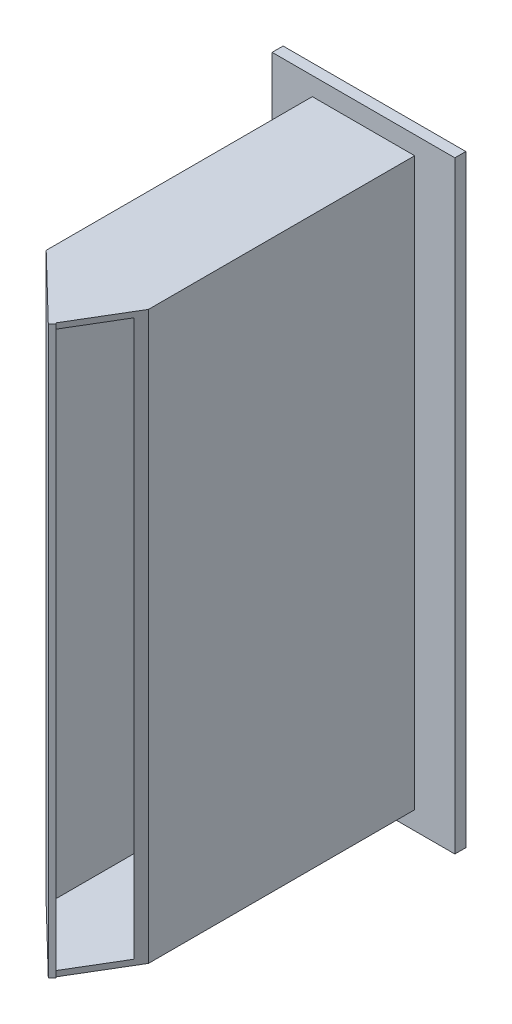
ISO-10303-21;
HEADER;
FILE_DESCRIPTION(('STEP AP214'),'2;1');
FILE_NAME('part.step','',(''),(''),'','','');
FILE_SCHEMA(('AUTOMOTIVE_DESIGN { 1 0 10303 214 1 1 1 1 }'));
ENDSEC;
DATA;
#1=APPLICATION_CONTEXT('core data for automotive mechanical design processes');
#2=APPLICATION_PROTOCOL_DEFINITION('international standard','automotive_design',2000,#1);
#3=PRODUCT_CONTEXT('',#1,'mechanical');
#4=PRODUCT('Part','Part','',(#3));
#5=PRODUCT_RELATED_PRODUCT_CATEGORY('part','',(#4));
#6=PRODUCT_DEFINITION_FORMATION('','',#4);
#7=PRODUCT_DEFINITION_CONTEXT('part definition',#1,'design');
#8=PRODUCT_DEFINITION('design','',#6,#7);
#9=PRODUCT_DEFINITION_SHAPE('','',#8);
#10=(LENGTH_UNIT() NAMED_UNIT(*) SI_UNIT(.MILLI.,.METRE.));
#11=(NAMED_UNIT(*) PLANE_ANGLE_UNIT() SI_UNIT($,.RADIAN.));
#12=(NAMED_UNIT(*) SI_UNIT($,.STERADIAN.) SOLID_ANGLE_UNIT());
#13=UNCERTAINTY_MEASURE_WITH_UNIT(LENGTH_MEASURE(1.E-05),#10,'distance_accuracy_value','');
#14=(GEOMETRIC_REPRESENTATION_CONTEXT(3) GLOBAL_UNCERTAINTY_ASSIGNED_CONTEXT((#13)) GLOBAL_UNIT_ASSIGNED_CONTEXT((#10,
#11,#12)) REPRESENTATION_CONTEXT('',''));
#15=CARTESIAN_POINT('',(0.,0.,0.));
#16=DIRECTION('',(0.,0.,1.));
#17=DIRECTION('',(1.,0.,0.));
#18=AXIS2_PLACEMENT_3D('',#15,#16,#17);
#19=CARTESIAN_POINT('',(2.5,31.7,0.6));
#20=DIRECTION('',(1.,0.,0.));
#21=DIRECTION('',(0.,1.,0.));
#22=AXIS2_PLACEMENT_3D('',#19,#20,#21);
#23=PLANE('',#22);
#24=DIRECTION('',(0.,0.,-1.));
#25=VECTOR('',#24,1.);
#26=CARTESIAN_POINT('',(2.5,31.7,0.6));
#27=LINE('',#26,#25);
#28=CARTESIAN_POINT('',(2.5,31.7,15.0387089135817));
#29=VERTEX_POINT('',#28);
#30=CARTESIAN_POINT('',(2.5,31.7,0.));
#31=VERTEX_POINT('',#30);
#32=EDGE_CURVE('E234',#29,#31,#27,.T.);
#33=ORIENTED_EDGE('',*,*,#32,.F.);
#34=DIRECTION('',(0.,-1.,0.));
#35=VECTOR('',#34,1.);
#36=CARTESIAN_POINT('',(2.5,31.7,15.0387089135817));
#37=LINE('',#36,#35);
#38=CARTESIAN_POINT('',(2.5,1.3,15.0387089135817));
#39=VERTEX_POINT('',#38);
#40=EDGE_CURVE('E179',#29,#39,#37,.T.);
#41=ORIENTED_EDGE('',*,*,#40,.T.);
#42=DIRECTION('',(0.,0.,-1.));
#43=VECTOR('',#42,1.);
#44=CARTESIAN_POINT('',(2.5,1.3,0.6));
#45=LINE('',#44,#43);
#46=CARTESIAN_POINT('',(2.5,1.3,0.));
#47=VERTEX_POINT('',#46);
#48=EDGE_CURVE('E240',#39,#47,#45,.T.);
#49=ORIENTED_EDGE('',*,*,#48,.T.);
#50=DIRECTION('',(0.,-1.,0.));
#51=VECTOR('',#50,1.);
#52=CARTESIAN_POINT('',(2.5,31.7,0.));
#53=LINE('',#52,#51);
#54=EDGE_CURVE('E222',#31,#47,#53,.T.);
#55=ORIENTED_EDGE('',*,*,#54,.F.);
#56=EDGE_LOOP('',(#33,#41,#49,#55));
#57=FACE_BOUND('',#56,.T.);
#58=ADVANCED_FACE('F35',(#57),#23,.T.);
#59=CARTESIAN_POINT('',(2.5,1.3,0.6));
#60=DIRECTION('',(0.,1.,0.));
#61=DIRECTION('',(-1.,0.,0.));
#62=AXIS2_PLACEMENT_3D('',#59,#60,#61);
#63=PLANE('',#62);
#64=ORIENTED_EDGE('',*,*,#48,.F.);
#65=DIRECTION('',(0.7186374720968,0.,0.695384917652318));
#66=VECTOR('',#65,1.);
#67=CARTESIAN_POINT('',(-4.71545108692323,1.3,8.05672417896356));
#68=LINE('',#67,#66);
#69=CARTESIAN_POINT('',(5.90696835590224,1.3,18.3354398823977));
#70=VERTEX_POINT('',#69);
#71=EDGE_CURVE('E182',#39,#70,#68,.T.);
#72=ORIENTED_EDGE('',*,*,#71,.T.);
#73=DIRECTION('',(-0.512760200720184,0.,0.85853187276734));
#74=VECTOR('',#73,1.);
#75=CARTESIAN_POINT('',(12.8187105792584,1.3,6.76287440877329));
#76=LINE('',#75,#74);
#77=CARTESIAN_POINT('',(7.5,1.3,15.668172729323));
#78=VERTEX_POINT('',#77);
#79=EDGE_CURVE('E199',#78,#70,#76,.T.);
#80=ORIENTED_EDGE('',*,*,#79,.F.);
#81=DIRECTION('',(0.,0.,-1.));
#82=VECTOR('',#81,1.);
#83=CARTESIAN_POINT('',(7.5,1.3,0.6));
#84=LINE('',#83,#82);
#85=CARTESIAN_POINT('',(7.5,1.3,0.));
#86=VERTEX_POINT('',#85);
#87=EDGE_CURVE('E238',#78,#86,#84,.T.);
#88=ORIENTED_EDGE('',*,*,#87,.T.);
#89=DIRECTION('',(1.,0.,0.));
#90=VECTOR('',#89,1.);
#91=CARTESIAN_POINT('',(2.5,1.3,0.));
#92=LINE('',#91,#90);
#93=EDGE_CURVE('E225',#47,#86,#92,.T.);
#94=ORIENTED_EDGE('',*,*,#93,.F.);
#95=EDGE_LOOP('',(#64,#72,#80,#88,#94));
#96=FACE_BOUND('',#95,.T.);
#97=ADVANCED_FACE('F291',(#96),#63,.T.);
#98=CARTESIAN_POINT('',(2.5,31.7,0.6));
#99=DIRECTION('',(0.,-1.,0.));
#100=DIRECTION('',(0.,0.,-1.));
#101=AXIS2_PLACEMENT_3D('',#98,#99,#100);
#102=PLANE('',#101);
#103=DIRECTION('',(0.512760200720184,0.,-0.85853187276734));
#104=VECTOR('',#103,1.);
#105=CARTESIAN_POINT('',(12.8187105792584,31.7,6.76287440877329));
#106=LINE('',#105,#104);
#107=CARTESIAN_POINT('',(5.90696835590223,31.7,18.3354398823977));
#108=VERTEX_POINT('',#107);
#109=CARTESIAN_POINT('',(7.5,31.7,15.668172729323));
#110=VERTEX_POINT('',#109);
#111=EDGE_CURVE('E195',#108,#110,#106,.T.);
#112=ORIENTED_EDGE('',*,*,#111,.F.);
#113=DIRECTION('',(-0.7186374720968,0.,-0.695384917652318));
#114=VECTOR('',#113,1.);
#115=CARTESIAN_POINT('',(-4.71545108692323,31.7,8.05672417896356));
#116=LINE('',#115,#114);
#117=EDGE_CURVE('E175',#108,#29,#116,.T.);
#118=ORIENTED_EDGE('',*,*,#117,.T.);
#119=ORIENTED_EDGE('',*,*,#32,.T.);
#120=DIRECTION('',(-1.,0.,0.));
#121=VECTOR('',#120,1.);
#122=CARTESIAN_POINT('',(2.5,31.7,0.));
#123=LINE('',#122,#121);
#124=CARTESIAN_POINT('',(7.5,31.7,0.));
#125=VERTEX_POINT('',#124);
#126=EDGE_CURVE('E231',#125,#31,#123,.T.);
#127=ORIENTED_EDGE('',*,*,#126,.F.);
#128=DIRECTION('',(0.,0.,-1.));
#129=VECTOR('',#128,1.);
#130=CARTESIAN_POINT('',(7.5,31.7,0.6));
#131=LINE('',#130,#129);
#132=EDGE_CURVE('E236',#110,#125,#131,.T.);
#133=ORIENTED_EDGE('',*,*,#132,.F.);
#134=EDGE_LOOP('',(#112,#118,#119,#127,#133));
#135=FACE_BOUND('',#134,.T.);
#136=ADVANCED_FACE('F282',(#135),#102,.T.);
#137=CARTESIAN_POINT('',(5.74895919711926,0.,18.6));
#138=DIRECTION('',(-0.85853187276734,0.,-0.512760200720184));
#139=DIRECTION('',(-0.512760200720184,0.,0.85853187276734));
#140=AXIS2_PLACEMENT_3D('',#137,#138,#139);
#141=PLANE('',#140);
#142=DIRECTION('',(0.,1.,0.));
#143=VECTOR('',#142,1.);
#144=CARTESIAN_POINT('',(5.90696835590223,0.,18.3354398823977));
#145=LINE('',#144,#143);
#146=CARTESIAN_POINT('',(5.90696835590223,1.,18.3354398823977));
#147=VERTEX_POINT('',#146);
#148=EDGE_CURVE('E11',#147,#70,#145,.T.);
#149=ORIENTED_EDGE('',*,*,#148,.F.);
#150=DIRECTION('',(-0.512760200720184,0.,0.85853187276734));
#151=VECTOR('',#150,1.);
#152=CARTESIAN_POINT('',(4.81585611493823,1.,20.1623262794279));
#153=LINE('',#152,#151);
#154=CARTESIAN_POINT('',(7.8,1.,15.1658725089306));
#155=VERTEX_POINT('',#154);
#156=EDGE_CURVE('E155',#155,#147,#153,.T.);
#157=ORIENTED_EDGE('',*,*,#156,.F.);
#158=DIRECTION('',(0.,1.,0.));
#159=VECTOR('',#158,1.);
#160=CARTESIAN_POINT('',(7.8,0.,15.1658725089306));
#161=LINE('',#160,#159);
#162=CARTESIAN_POINT('',(7.8,32.,15.1658725089306));
#163=VERTEX_POINT('',#162);
#164=EDGE_CURVE('E50',#155,#163,#161,.T.);
#165=ORIENTED_EDGE('',*,*,#164,.T.);
#166=DIRECTION('',(-0.512760200720184,0.,0.85853187276734));
#167=VECTOR('',#166,1.);
#168=CARTESIAN_POINT('',(5.74895919711926,32.,18.6));
#169=LINE('',#168,#167);
#170=CARTESIAN_POINT('',(5.90696835590224,32.,18.3354398823977));
#171=VERTEX_POINT('',#170);
#172=EDGE_CURVE('E185',#163,#171,#169,.T.);
#173=ORIENTED_EDGE('',*,*,#172,.T.);
#174=EDGE_CURVE('E39',#108,#171,#145,.T.);
#175=ORIENTED_EDGE('',*,*,#174,.F.);
#176=ORIENTED_EDGE('',*,*,#111,.T.);
#177=DIRECTION('',(0.,-1.,0.));
#178=VECTOR('',#177,1.);
#179=CARTESIAN_POINT('',(7.5,31.7,15.668172729323));
#180=LINE('',#179,#178);
#181=EDGE_CURVE('E197',#110,#78,#180,.T.);
#182=ORIENTED_EDGE('',*,*,#181,.T.);
#183=ORIENTED_EDGE('',*,*,#79,.T.);
#184=EDGE_LOOP('',(#149,#157,#165,#173,#175,#176,#182,#183));
#185=FACE_BOUND('',#184,.T.);
#186=ADVANCED_FACE('F279',(#185),#141,.F.);
#187=CARTESIAN_POINT('',(0.,0.,0.6));
#188=DIRECTION('',(0.,0.,-1.));
#189=DIRECTION('',(-1.,0.,0.));
#190=AXIS2_PLACEMENT_3D('',#187,#188,#189);
#191=PLANE('',#190);
#192=DIRECTION('',(0.,-1.,0.));
#193=VECTOR('',#192,1.);
#194=CARTESIAN_POINT('',(0.,0.,0.6));
#195=LINE('',#194,#193);
#196=CARTESIAN_POINT('',(0.,33.,0.6));
#197=VERTEX_POINT('',#196);
#198=CARTESIAN_POINT('',(0.,0.,0.6));
#199=VERTEX_POINT('',#198);
#200=EDGE_CURVE('E243',#197,#199,#195,.T.);
#201=ORIENTED_EDGE('',*,*,#200,.T.);
#202=DIRECTION('',(1.,0.,0.));
#203=VECTOR('',#202,1.);
#204=CARTESIAN_POINT('',(0.,0.,0.6));
#205=LINE('',#204,#203);
#206=CARTESIAN_POINT('',(10.,0.,0.6));
#207=VERTEX_POINT('',#206);
#208=EDGE_CURVE('E246',#199,#207,#205,.T.);
#209=ORIENTED_EDGE('',*,*,#208,.T.);
#210=DIRECTION('',(0.,1.,0.));
#211=VECTOR('',#210,1.);
#212=CARTESIAN_POINT('',(10.,0.,0.6));
#213=LINE('',#212,#211);
#214=CARTESIAN_POINT('',(10.,33.,0.6));
#215=VERTEX_POINT('',#214);
#216=EDGE_CURVE('E249',#207,#215,#213,.T.);
#217=ORIENTED_EDGE('',*,*,#216,.T.);
#218=DIRECTION('',(-1.,0.,0.));
#219=VECTOR('',#218,1.);
#220=CARTESIAN_POINT('',(0.,33.,0.6));
#221=LINE('',#220,#219);
#222=EDGE_CURVE('E251',#215,#197,#221,.T.);
#223=ORIENTED_EDGE('',*,*,#222,.T.);
#224=EDGE_LOOP('',(#201,#209,#217,#223));
#225=FACE_BOUND('',#224,.T.);
#226=DIRECTION('',(0.,-1.,0.));
#227=VECTOR('',#226,1.);
#228=CARTESIAN_POINT('',(2.2,32.,0.6));
#229=LINE('',#228,#227);
#230=CARTESIAN_POINT('',(2.2,32.,0.6));
#231=VERTEX_POINT('',#230);
#232=CARTESIAN_POINT('',(2.2,1.,0.6));
#233=VERTEX_POINT('',#232);
#234=EDGE_CURVE('E204',#231,#233,#229,.T.);
#235=ORIENTED_EDGE('',*,*,#234,.F.);
#236=DIRECTION('',(-1.,0.,0.));
#237=VECTOR('',#236,1.);
#238=CARTESIAN_POINT('',(2.2,32.,0.6));
#239=LINE('',#238,#237);
#240=CARTESIAN_POINT('',(7.8,32.,0.6));
#241=VERTEX_POINT('',#240);
#242=EDGE_CURVE('E212',#241,#231,#239,.T.);
#243=ORIENTED_EDGE('',*,*,#242,.F.);
#244=DIRECTION('',(0.,1.,0.));
#245=VECTOR('',#244,1.);
#246=CARTESIAN_POINT('',(7.8,32.,0.6));
#247=LINE('',#246,#245);
#248=CARTESIAN_POINT('',(7.8,1.,0.6));
#249=VERTEX_POINT('',#248);
#250=EDGE_CURVE('E209',#249,#241,#247,.T.);
#251=ORIENTED_EDGE('',*,*,#250,.F.);
#252=DIRECTION('',(1.,0.,0.));
#253=VECTOR('',#252,1.);
#254=CARTESIAN_POINT('',(2.2,1.,0.6));
#255=LINE('',#254,#253);
#256=EDGE_CURVE('E207',#233,#249,#255,.T.);
#257=ORIENTED_EDGE('',*,*,#256,.F.);
#258=EDGE_LOOP('',(#235,#243,#251,#257));
#259=FACE_BOUND('',#258,.T.);
#260=ADVANCED_FACE('F281',(#225,#259),#191,.F.);
#261=CARTESIAN_POINT('',(0.,0.,0.));
#262=DIRECTION('',(0.,0.,-1.));
#263=DIRECTION('',(-1.,0.,0.));
#264=AXIS2_PLACEMENT_3D('',#261,#262,#263);
#265=PLANE('',#264);
#266=DIRECTION('',(0.,-1.,0.));
#267=VECTOR('',#266,1.);
#268=CARTESIAN_POINT('',(0.,0.,0.));
#269=LINE('',#268,#267);
#270=CARTESIAN_POINT('',(0.,33.,0.));
#271=VERTEX_POINT('',#270);
#272=CARTESIAN_POINT('',(0.,0.,0.));
#273=VERTEX_POINT('',#272);
#274=EDGE_CURVE('E242',#271,#273,#269,.T.);
#275=ORIENTED_EDGE('',*,*,#274,.F.);
#276=DIRECTION('',(-1.,0.,0.));
#277=VECTOR('',#276,1.);
#278=CARTESIAN_POINT('',(0.,33.,0.));
#279=LINE('',#278,#277);
#280=CARTESIAN_POINT('',(10.,33.,0.));
#281=VERTEX_POINT('',#280);
#282=EDGE_CURVE('E247',#281,#271,#279,.T.);
#283=ORIENTED_EDGE('',*,*,#282,.F.);
#284=DIRECTION('',(0.,1.,0.));
#285=VECTOR('',#284,1.);
#286=CARTESIAN_POINT('',(10.,0.,0.));
#287=LINE('',#286,#285);
#288=CARTESIAN_POINT('',(10.,0.,0.));
#289=VERTEX_POINT('',#288);
#290=EDGE_CURVE('E258',#289,#281,#287,.T.);
#291=ORIENTED_EDGE('',*,*,#290,.F.);
#292=DIRECTION('',(1.,0.,0.));
#293=VECTOR('',#292,1.);
#294=CARTESIAN_POINT('',(0.,0.,0.));
#295=LINE('',#294,#293);
#296=EDGE_CURVE('E256',#273,#289,#295,.T.);
#297=ORIENTED_EDGE('',*,*,#296,.F.);
#298=EDGE_LOOP('',(#275,#283,#291,#297));
#299=FACE_BOUND('',#298,.T.);
#300=ORIENTED_EDGE('',*,*,#126,.T.);
#301=ORIENTED_EDGE('',*,*,#54,.T.);
#302=ORIENTED_EDGE('',*,*,#93,.T.);
#303=DIRECTION('',(0.,1.,0.));
#304=VECTOR('',#303,1.);
#305=CARTESIAN_POINT('',(7.5,31.7,0.));
#306=LINE('',#305,#304);
#307=EDGE_CURVE('E228',#86,#125,#306,.T.);
#308=ORIENTED_EDGE('',*,*,#307,.T.);
#309=EDGE_LOOP('',(#300,#301,#302,#308));
#310=FACE_BOUND('',#309,.T.);
#311=ADVANCED_FACE('F288',(#299,#310),#265,.T.);
#312=CARTESIAN_POINT('',(0.,0.,0.6));
#313=DIRECTION('',(1.,0.,0.));
#314=DIRECTION('',(0.,0.,-1.));
#315=AXIS2_PLACEMENT_3D('',#312,#313,#314);
#316=PLANE('',#315);
#317=ORIENTED_EDGE('',*,*,#274,.T.);
#318=DIRECTION('',(0.,0.,-1.));
#319=VECTOR('',#318,1.);
#320=CARTESIAN_POINT('',(0.,0.,0.6));
#321=LINE('',#320,#319);
#322=EDGE_CURVE('E268',#199,#273,#321,.T.);
#323=ORIENTED_EDGE('',*,*,#322,.F.);
#324=ORIENTED_EDGE('',*,*,#200,.F.);
#325=DIRECTION('',(0.,0.,-1.));
#326=VECTOR('',#325,1.);
#327=CARTESIAN_POINT('',(0.,33.,0.6));
#328=LINE('',#327,#326);
#329=EDGE_CURVE('E253',#197,#271,#328,.T.);
#330=ORIENTED_EDGE('',*,*,#329,.T.);
#331=EDGE_LOOP('',(#317,#323,#324,#330));
#332=FACE_BOUND('',#331,.T.);
#333=ADVANCED_FACE('F37',(#332),#316,.F.);
#334=CARTESIAN_POINT('',(0.,0.,0.6));
#335=DIRECTION('',(0.,1.,0.));
#336=DIRECTION('',(0.,0.,1.));
#337=AXIS2_PLACEMENT_3D('',#334,#335,#336);
#338=PLANE('',#337);
#339=ORIENTED_EDGE('',*,*,#296,.T.);
#340=DIRECTION('',(0.,0.,-1.));
#341=VECTOR('',#340,1.);
#342=CARTESIAN_POINT('',(10.,0.,0.6));
#343=LINE('',#342,#341);
#344=EDGE_CURVE('E266',#207,#289,#343,.T.);
#345=ORIENTED_EDGE('',*,*,#344,.F.);
#346=ORIENTED_EDGE('',*,*,#208,.F.);
#347=ORIENTED_EDGE('',*,*,#322,.T.);
#348=EDGE_LOOP('',(#339,#345,#346,#347));
#349=FACE_BOUND('',#348,.T.);
#350=ADVANCED_FACE('F317',(#349),#338,.F.);
#351=CARTESIAN_POINT('',(10.,0.,0.6));
#352=DIRECTION('',(-1.,0.,0.));
#353=DIRECTION('',(0.,0.,1.));
#354=AXIS2_PLACEMENT_3D('',#351,#352,#353);
#355=PLANE('',#354);
#356=ORIENTED_EDGE('',*,*,#290,.T.);
#357=DIRECTION('',(0.,0.,-1.));
#358=VECTOR('',#357,1.);
#359=CARTESIAN_POINT('',(10.,33.,0.6));
#360=LINE('',#359,#358);
#361=EDGE_CURVE('E263',#215,#281,#360,.T.);
#362=ORIENTED_EDGE('',*,*,#361,.F.);
#363=ORIENTED_EDGE('',*,*,#216,.F.);
#364=ORIENTED_EDGE('',*,*,#344,.T.);
#365=EDGE_LOOP('',(#356,#362,#363,#364));
#366=FACE_BOUND('',#365,.T.);
#367=ADVANCED_FACE('F314',(#366),#355,.F.);
#368=CARTESIAN_POINT('',(0.,33.,0.6));
#369=DIRECTION('',(0.,-1.,0.));
#370=DIRECTION('',(0.,0.,-1.));
#371=AXIS2_PLACEMENT_3D('',#368,#369,#370);
#372=PLANE('',#371);
#373=ORIENTED_EDGE('',*,*,#282,.T.);
#374=ORIENTED_EDGE('',*,*,#329,.F.);
#375=ORIENTED_EDGE('',*,*,#222,.F.);
#376=ORIENTED_EDGE('',*,*,#361,.T.);
#377=EDGE_LOOP('',(#373,#374,#375,#376));
#378=FACE_BOUND('',#377,.T.);
#379=ADVANCED_FACE('F310',(#378),#372,.F.);
#380=CARTESIAN_POINT('',(7.5,31.7,0.6));
#381=DIRECTION('',(-1.,0.,0.));
#382=DIRECTION('',(0.,-1.,0.));
#383=AXIS2_PLACEMENT_3D('',#380,#381,#382);
#384=PLANE('',#383);
#385=ORIENTED_EDGE('',*,*,#181,.F.);
#386=ORIENTED_EDGE('',*,*,#132,.T.);
#387=ORIENTED_EDGE('',*,*,#307,.F.);
#388=ORIENTED_EDGE('',*,*,#87,.F.);
#389=EDGE_LOOP('',(#385,#386,#387,#388));
#390=FACE_BOUND('',#389,.T.);
#391=ADVANCED_FACE('F313',(#390),#384,.T.);
#392=CARTESIAN_POINT('',(2.2,32.,18.6));
#393=DIRECTION('',(1.,0.,0.));
#394=DIRECTION('',(0.,1.,0.));
#395=AXIS2_PLACEMENT_3D('',#392,#393,#394);
#396=PLANE('',#395);
#397=DIRECTION('',(0.,0.,-1.));
#398=VECTOR('',#397,1.);
#399=CARTESIAN_POINT('',(2.2,1.,18.6));
#400=LINE('',#399,#398);
#401=CARTESIAN_POINT('',(2.2,1.,15.1658725089306));
#402=VERTEX_POINT('',#401);
#403=EDGE_CURVE('E58',#402,#233,#400,.T.);
#404=ORIENTED_EDGE('',*,*,#403,.F.);
#405=DIRECTION('',(0.,1.,0.));
#406=VECTOR('',#405,1.);
#407=CARTESIAN_POINT('',(2.2,0.,15.1658725089306));
#408=LINE('',#407,#406);
#409=CARTESIAN_POINT('',(2.2,32.,15.1658725089306));
#410=VERTEX_POINT('',#409);
#411=EDGE_CURVE('E189',#402,#410,#408,.T.);
#412=ORIENTED_EDGE('',*,*,#411,.T.);
#413=DIRECTION('',(0.,0.,-1.));
#414=VECTOR('',#413,1.);
#415=CARTESIAN_POINT('',(2.2,32.,18.6));
#416=LINE('',#415,#414);
#417=EDGE_CURVE('E215',#410,#231,#416,.T.);
#418=ORIENTED_EDGE('',*,*,#417,.T.);
#419=ORIENTED_EDGE('',*,*,#234,.T.);
#420=EDGE_LOOP('',(#404,#412,#418,#419));
#421=FACE_BOUND('',#420,.T.);
#422=ADVANCED_FACE('F348',(#421),#396,.F.);
#423=CARTESIAN_POINT('',(2.2,1.,18.6));
#424=DIRECTION('',(0.,1.,0.));
#425=DIRECTION('',(0.,0.,1.));
#426=AXIS2_PLACEMENT_3D('',#423,#424,#425);
#427=PLANE('',#426);
#428=DIRECTION('',(-0.718637472096801,0.,-0.695384917652317));
#429=VECTOR('',#428,1.);
#430=CARTESIAN_POINT('',(3.91613536129684,1.,16.8264798293556));
#431=LINE('',#430,#429);
#432=CARTESIAN_POINT('',(5.74895919711926,1.,18.6));
#433=VERTEX_POINT('',#432);
#434=EDGE_CURVE('E202',#433,#402,#431,.T.);
#435=ORIENTED_EDGE('',*,*,#434,.T.);
#436=ORIENTED_EDGE('',*,*,#403,.T.);
#437=ORIENTED_EDGE('',*,*,#256,.T.);
#438=DIRECTION('',(0.,0.,-1.));
#439=VECTOR('',#438,1.);
#440=CARTESIAN_POINT('',(7.8,1.,18.6));
#441=LINE('',#440,#439);
#442=EDGE_CURVE('E219',#155,#249,#441,.T.);
#443=ORIENTED_EDGE('',*,*,#442,.F.);
#444=ORIENTED_EDGE('',*,*,#156,.T.);
#445=DIRECTION('',(0.7186374720968,0.,0.695384917652318));
#446=VECTOR('',#445,1.);
#447=CARTESIAN_POINT('',(2.40861547529569,1.,14.9502812673016));
#448=LINE('',#447,#446);
#449=CARTESIAN_POINT('',(5.95757467241496,1.,18.384408758371));
#450=VERTEX_POINT('',#449);
#451=EDGE_CURVE('E149',#147,#450,#448,.T.);
#452=ORIENTED_EDGE('',*,*,#451,.T.);
#453=DIRECTION('',(-0.695384917652317,0.,0.718637472096801));
#454=VECTOR('',#453,1.);
#455=CARTESIAN_POINT('',(5.95757467241496,1.,18.384408758371));
#456=LINE('',#455,#454);
#457=EDGE_CURVE('E152',#450,#433,#456,.T.);
#458=ORIENTED_EDGE('',*,*,#457,.T.);
#459=EDGE_LOOP('',(#435,#436,#437,#443,#444,#452,#458));
#460=FACE_BOUND('',#459,.T.);
#461=ADVANCED_FACE('F151',(#460),#427,.F.);
#462=CARTESIAN_POINT('',(7.8,32.,18.6));
#463=DIRECTION('',(-1.,0.,0.));
#464=DIRECTION('',(0.,-1.,0.));
#465=AXIS2_PLACEMENT_3D('',#462,#463,#464);
#466=PLANE('',#465);
#467=DIRECTION('',(0.,0.,-1.));
#468=VECTOR('',#467,1.);
#469=CARTESIAN_POINT('',(7.8,32.,18.6));
#470=LINE('',#469,#468);
#471=EDGE_CURVE('E217',#163,#241,#470,.T.);
#472=ORIENTED_EDGE('',*,*,#471,.F.);
#473=ORIENTED_EDGE('',*,*,#164,.F.);
#474=ORIENTED_EDGE('',*,*,#442,.T.);
#475=ORIENTED_EDGE('',*,*,#250,.T.);
#476=EDGE_LOOP('',(#472,#473,#474,#475));
#477=FACE_BOUND('',#476,.T.);
#478=ADVANCED_FACE('F340',(#477),#466,.F.);
#479=CARTESIAN_POINT('',(2.2,32.,18.6));
#480=DIRECTION('',(0.,-1.,0.));
#481=DIRECTION('',(0.,0.,-1.));
#482=AXIS2_PLACEMENT_3D('',#479,#480,#481);
#483=PLANE('',#482);
#484=ORIENTED_EDGE('',*,*,#417,.F.);
#485=DIRECTION('',(-0.718637472096801,0.,-0.695384917652317));
#486=VECTOR('',#485,1.);
#487=CARTESIAN_POINT('',(2.2,32.,15.1658725089306));
#488=LINE('',#487,#486);
#489=CARTESIAN_POINT('',(5.74895919711926,32.,18.6));
#490=VERTEX_POINT('',#489);
#491=EDGE_CURVE('E187',#490,#410,#488,.T.);
#492=ORIENTED_EDGE('',*,*,#491,.F.);
#493=DIRECTION('',(-0.695384917652317,0.,0.718637472096801));
#494=VECTOR('',#493,1.);
#495=CARTESIAN_POINT('',(5.95757467241495,32.,18.384408758371));
#496=LINE('',#495,#494);
#497=CARTESIAN_POINT('',(5.95757467241495,32.,18.384408758371));
#498=VERTEX_POINT('',#497);
#499=EDGE_CURVE('E167',#498,#490,#496,.T.);
#500=ORIENTED_EDGE('',*,*,#499,.F.);
#501=DIRECTION('',(-0.718637472096801,0.,-0.695384917652317));
#502=VECTOR('',#501,1.);
#503=CARTESIAN_POINT('',(2.40861547529569,32.,14.9502812673016));
#504=LINE('',#503,#502);
#505=EDGE_CURVE('E168',#498,#171,#504,.T.);
#506=ORIENTED_EDGE('',*,*,#505,.T.);
#507=ORIENTED_EDGE('',*,*,#172,.F.);
#508=ORIENTED_EDGE('',*,*,#471,.T.);
#509=ORIENTED_EDGE('',*,*,#242,.T.);
#510=EDGE_LOOP('',(#484,#492,#500,#506,#507,#508,#509));
#511=FACE_BOUND('',#510,.T.);
#512=ADVANCED_FACE('F276',(#511),#483,.F.);
#513=CARTESIAN_POINT('',(2.2,0.,15.1658725089306));
#514=DIRECTION('',(0.695384917652317,0.,-0.718637472096801));
#515=DIRECTION('',(-0.718637472096801,0.,-0.695384917652317));
#516=AXIS2_PLACEMENT_3D('',#513,#514,#515);
#517=PLANE('',#516);
#518=ORIENTED_EDGE('',*,*,#434,.F.);
#519=DIRECTION('',(0.,1.,0.));
#520=VECTOR('',#519,1.);
#521=CARTESIAN_POINT('',(5.74895919711926,0.,18.6));
#522=LINE('',#521,#520);
#523=EDGE_CURVE('E166',#433,#490,#522,.T.);
#524=ORIENTED_EDGE('',*,*,#523,.T.);
#525=ORIENTED_EDGE('',*,*,#491,.T.);
#526=ORIENTED_EDGE('',*,*,#411,.F.);
#527=EDGE_LOOP('',(#518,#524,#525,#526));
#528=FACE_BOUND('',#527,.T.);
#529=ADVANCED_FACE('F347',(#528),#517,.F.);
#530=CARTESIAN_POINT('',(-6.30638842329097,0.,6.51726392035481));
#531=DIRECTION('',(-0.695384917652318,0.,0.7186374720968));
#532=DIRECTION('',(0.7186374720968,0.,0.695384917652318));
#533=AXIS2_PLACEMENT_3D('',#530,#531,#532);
#534=PLANE('',#533);
#535=ORIENTED_EDGE('',*,*,#451,.F.);
#536=ORIENTED_EDGE('',*,*,#148,.T.);
#537=ORIENTED_EDGE('',*,*,#71,.F.);
#538=ORIENTED_EDGE('',*,*,#40,.F.);
#539=ORIENTED_EDGE('',*,*,#117,.F.);
#540=ORIENTED_EDGE('',*,*,#174,.T.);
#541=ORIENTED_EDGE('',*,*,#505,.F.);
#542=DIRECTION('',(0.,1.,0.));
#543=VECTOR('',#542,1.);
#544=CARTESIAN_POINT('',(5.95757467241495,32.,18.384408758371));
#545=LINE('',#544,#543);
#546=EDGE_CURVE('E159',#450,#498,#545,.T.);
#547=ORIENTED_EDGE('',*,*,#546,.F.);
#548=EDGE_LOOP('',(#535,#536,#537,#538,#539,#540,#541,#547));
#549=FACE_BOUND('',#548,.T.);
#550=ADVANCED_FACE('F170',(#549),#534,.F.);
#551=CARTESIAN_POINT('',(5.95757467241495,32.,18.384408758371));
#552=DIRECTION('',(0.718637472096801,0.,0.695384917652317));
#553=DIRECTION('',(0.695384917652317,0.,-0.718637472096801));
#554=AXIS2_PLACEMENT_3D('',#551,#552,#553);
#555=PLANE('',#554);
#556=ORIENTED_EDGE('',*,*,#523,.F.);
#557=ORIENTED_EDGE('',*,*,#457,.F.);
#558=ORIENTED_EDGE('',*,*,#546,.T.);
#559=ORIENTED_EDGE('',*,*,#499,.T.);
#560=EDGE_LOOP('',(#556,#557,#558,#559));
#561=FACE_BOUND('',#560,.T.);
#562=ADVANCED_FACE('F163',(#561),#555,.T.);
#563=CLOSED_SHELL('',(#58,#97,#136,#186,#260,#311,#333,#350,#367,#379,#391,#422,#461,#478,#512,
#529,#550,#562));
#564=MANIFOLD_SOLID_BREP('B2',#563);
#565=ADVANCED_BREP_SHAPE_REPRESENTATION('',(#18,#564),#14);
#566=SHAPE_DEFINITION_REPRESENTATION(#9,#565);
ENDSEC;
END-ISO-10303-21;
